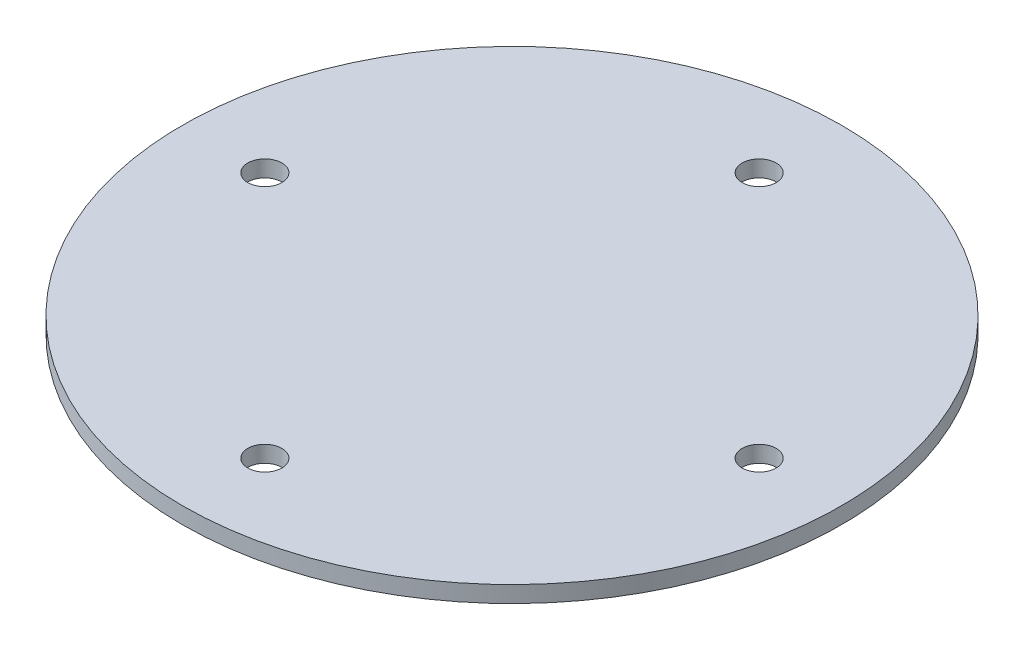
ISO-10303-21;
HEADER;
FILE_DESCRIPTION(('STEP AP214'),'2;1');
FILE_NAME('part.step','',(''),(''),'','','');
FILE_SCHEMA(('AUTOMOTIVE_DESIGN { 1 0 10303 214 1 1 1 1 }'));
ENDSEC;
DATA;
#1=APPLICATION_CONTEXT('core data for automotive mechanical design processes');
#2=APPLICATION_PROTOCOL_DEFINITION('international standard','automotive_design',2000,#1);
#3=PRODUCT_CONTEXT('',#1,'mechanical');
#4=PRODUCT('Part','Part','',(#3));
#5=PRODUCT_RELATED_PRODUCT_CATEGORY('part','',(#4));
#6=PRODUCT_DEFINITION_FORMATION('','',#4);
#7=PRODUCT_DEFINITION_CONTEXT('part definition',#1,'design');
#8=PRODUCT_DEFINITION('design','',#6,#7);
#9=PRODUCT_DEFINITION_SHAPE('','',#8);
#10=(LENGTH_UNIT() NAMED_UNIT(*) SI_UNIT(.MILLI.,.METRE.));
#11=(NAMED_UNIT(*) PLANE_ANGLE_UNIT() SI_UNIT($,.RADIAN.));
#12=(NAMED_UNIT(*) SI_UNIT($,.STERADIAN.) SOLID_ANGLE_UNIT());
#13=UNCERTAINTY_MEASURE_WITH_UNIT(LENGTH_MEASURE(1.E-05),#10,'distance_accuracy_value','');
#14=(GEOMETRIC_REPRESENTATION_CONTEXT(3) GLOBAL_UNCERTAINTY_ASSIGNED_CONTEXT((#13)) GLOBAL_UNIT_ASSIGNED_CONTEXT((#10,
#11,#12)) REPRESENTATION_CONTEXT('',''));
#15=CARTESIAN_POINT('',(0.,0.,0.));
#16=DIRECTION('',(0.,0.,1.));
#17=DIRECTION('',(1.,0.,0.));
#18=AXIS2_PLACEMENT_3D('',#15,#16,#17);
#19=CARTESIAN_POINT('',(0.,3.,0.));
#20=DIRECTION('',(0.,1.,0.));
#21=DIRECTION('',(0.,0.,1.));
#22=AXIS2_PLACEMENT_3D('',#19,#20,#21);
#23=PLANE('',#22);
#24=CARTESIAN_POINT('',(45.,3.,3.14233320495882E-13));
#25=DIRECTION('',(0.,1.,0.));
#26=DIRECTION('',(0.,0.,1.));
#27=AXIS2_PLACEMENT_3D('',#24,#25,#26);
#28=CIRCLE('',#27,3.1);
#29=CARTESIAN_POINT('',(45.,3.,3.10000000000031));
#30=VERTEX_POINT('',#29);
#31=EDGE_CURVE('E56',#30,#30,#28,.T.);
#32=ORIENTED_EDGE('',*,*,#31,.F.);
#33=EDGE_LOOP('',(#32));
#34=FACE_BOUND('',#33,.T.);
#35=CARTESIAN_POINT('',(-45.,3.,0.));
#36=DIRECTION('',(0.,1.,0.));
#37=DIRECTION('',(0.,0.,1.));
#38=AXIS2_PLACEMENT_3D('',#35,#36,#37);
#39=CIRCLE('',#38,3.1);
#40=CARTESIAN_POINT('',(-45.,3.,3.1));
#41=VERTEX_POINT('',#40);
#42=EDGE_CURVE('E48',#41,#41,#39,.T.);
#43=ORIENTED_EDGE('',*,*,#42,.F.);
#44=EDGE_LOOP('',(#43));
#45=FACE_BOUND('',#44,.T.);
#46=CARTESIAN_POINT('',(0.,3.,0.));
#47=DIRECTION('',(0.,1.,0.));
#48=DIRECTION('',(0.,0.,1.));
#49=AXIS2_PLACEMENT_3D('',#46,#47,#48);
#50=CIRCLE('',#49,60.);
#51=CARTESIAN_POINT('',(0.,3.,60.));
#52=VERTEX_POINT('',#51);
#53=EDGE_CURVE('E10',#52,#52,#50,.T.);
#54=ORIENTED_EDGE('',*,*,#53,.T.);
#55=EDGE_LOOP('',(#54));
#56=FACE_BOUND('',#55,.T.);
#57=CARTESIAN_POINT('',(1.57116660247941E-13,3.,-45.));
#58=DIRECTION('',(0.,1.,0.));
#59=DIRECTION('',(0.,0.,1.));
#60=AXIS2_PLACEMENT_3D('',#57,#58,#59);
#61=CIRCLE('',#60,3.09999999999999);
#62=CARTESIAN_POINT('',(1.57116660247941E-13,3.,-41.9));
#63=VERTEX_POINT('',#62);
#64=EDGE_CURVE('E52',#63,#63,#61,.T.);
#65=ORIENTED_EDGE('',*,*,#64,.F.);
#66=EDGE_LOOP('',(#65));
#67=FACE_BOUND('',#66,.T.);
#68=CARTESIAN_POINT('',(-4.71349980743823E-13,3.,45.));
#69=DIRECTION('',(0.,1.,0.));
#70=DIRECTION('',(0.,0.,1.));
#71=AXIS2_PLACEMENT_3D('',#68,#69,#70);
#72=CIRCLE('',#71,3.09999999999999);
#73=CARTESIAN_POINT('',(-4.71349980743823E-13,3.,48.1));
#74=VERTEX_POINT('',#73);
#75=EDGE_CURVE('E65',#74,#74,#72,.T.);
#76=ORIENTED_EDGE('',*,*,#75,.F.);
#77=EDGE_LOOP('',(#76));
#78=FACE_BOUND('',#77,.T.);
#79=ADVANCED_FACE('F40',(#34,#45,#56,#67,#78),#23,.T.);
#80=CARTESIAN_POINT('',(0.,0.,0.));
#81=DIRECTION('',(0.,1.,0.));
#82=DIRECTION('',(0.,0.,1.));
#83=AXIS2_PLACEMENT_3D('',#80,#81,#82);
#84=PLANE('',#83);
#85=CARTESIAN_POINT('',(0.,0.,0.));
#86=DIRECTION('',(0.,1.,0.));
#87=DIRECTION('',(0.,0.,1.));
#88=AXIS2_PLACEMENT_3D('',#85,#86,#87);
#89=CIRCLE('',#88,60.);
#90=CARTESIAN_POINT('',(0.,0.,60.));
#91=VERTEX_POINT('',#90);
#92=EDGE_CURVE('E41',#91,#91,#89,.T.);
#93=ORIENTED_EDGE('',*,*,#92,.F.);
#94=EDGE_LOOP('',(#93));
#95=FACE_BOUND('',#94,.T.);
#96=CARTESIAN_POINT('',(-45.,0.,0.));
#97=DIRECTION('',(0.,1.,0.));
#98=DIRECTION('',(0.,0.,1.));
#99=AXIS2_PLACEMENT_3D('',#96,#97,#98);
#100=CIRCLE('',#99,3.1);
#101=CARTESIAN_POINT('',(-45.,0.,3.1));
#102=VERTEX_POINT('',#101);
#103=EDGE_CURVE('E49',#102,#102,#100,.T.);
#104=ORIENTED_EDGE('',*,*,#103,.T.);
#105=EDGE_LOOP('',(#104));
#106=FACE_BOUND('',#105,.T.);
#107=CARTESIAN_POINT('',(1.57116660247941E-13,0.,-45.));
#108=DIRECTION('',(0.,1.,0.));
#109=DIRECTION('',(0.,0.,1.));
#110=AXIS2_PLACEMENT_3D('',#107,#108,#109);
#111=CIRCLE('',#110,3.09999999999999);
#112=CARTESIAN_POINT('',(1.57116660247941E-13,0.,-41.9));
#113=VERTEX_POINT('',#112);
#114=EDGE_CURVE('E57',#113,#113,#111,.T.);
#115=ORIENTED_EDGE('',*,*,#114,.T.);
#116=EDGE_LOOP('',(#115));
#117=FACE_BOUND('',#116,.T.);
#118=CARTESIAN_POINT('',(45.,0.,3.14233320495882E-13));
#119=DIRECTION('',(0.,1.,0.));
#120=DIRECTION('',(0.,0.,1.));
#121=AXIS2_PLACEMENT_3D('',#118,#119,#120);
#122=CIRCLE('',#121,3.1);
#123=CARTESIAN_POINT('',(45.,0.,3.10000000000031));
#124=VERTEX_POINT('',#123);
#125=EDGE_CURVE('E62',#124,#124,#122,.T.);
#126=ORIENTED_EDGE('',*,*,#125,.T.);
#127=EDGE_LOOP('',(#126));
#128=FACE_BOUND('',#127,.T.);
#129=CARTESIAN_POINT('',(-4.71349980743823E-13,0.,45.));
#130=DIRECTION('',(0.,1.,0.));
#131=DIRECTION('',(0.,0.,1.));
#132=AXIS2_PLACEMENT_3D('',#129,#130,#131);
#133=CIRCLE('',#132,3.09999999999999);
#134=CARTESIAN_POINT('',(-4.71349980743823E-13,0.,48.1));
#135=VERTEX_POINT('',#134);
#136=EDGE_CURVE('E66',#135,#135,#133,.T.);
#137=ORIENTED_EDGE('',*,*,#136,.T.);
#138=EDGE_LOOP('',(#137));
#139=FACE_BOUND('',#138,.T.);
#140=ADVANCED_FACE('F76',(#95,#106,#117,#128,#139),#84,.F.);
#141=CARTESIAN_POINT('',(0.,3.,0.));
#142=DIRECTION('',(0.,-1.,0.));
#143=DIRECTION('',(0.,0.,-1.));
#144=AXIS2_PLACEMENT_3D('',#141,#142,#143);
#145=CYLINDRICAL_SURFACE('',#144,60.);
#146=ORIENTED_EDGE('',*,*,#53,.F.);
#147=EDGE_LOOP('',(#146));
#148=FACE_BOUND('',#147,.T.);
#149=ORIENTED_EDGE('',*,*,#92,.T.);
#150=EDGE_LOOP('',(#149));
#151=FACE_BOUND('',#150,.T.);
#152=ADVANCED_FACE('F39',(#148,#151),#145,.T.);
#153=CARTESIAN_POINT('',(-45.,3.,0.));
#154=DIRECTION('',(0.,-1.,0.));
#155=DIRECTION('',(0.,0.,-1.));
#156=AXIS2_PLACEMENT_3D('',#153,#154,#155);
#157=CYLINDRICAL_SURFACE('',#156,3.1);
#158=ORIENTED_EDGE('',*,*,#42,.T.);
#159=EDGE_LOOP('',(#158));
#160=FACE_BOUND('',#159,.T.);
#161=ORIENTED_EDGE('',*,*,#103,.F.);
#162=EDGE_LOOP('',(#161));
#163=FACE_BOUND('',#162,.T.);
#164=ADVANCED_FACE('F88',(#160,#163),#157,.F.);
#165=CARTESIAN_POINT('',(1.57116660247941E-13,3.,-45.));
#166=DIRECTION('',(0.,-1.,0.));
#167=DIRECTION('',(0.,0.,-1.));
#168=AXIS2_PLACEMENT_3D('',#165,#166,#167);
#169=CYLINDRICAL_SURFACE('',#168,3.09999999999999);
#170=ORIENTED_EDGE('',*,*,#64,.T.);
#171=EDGE_LOOP('',(#170));
#172=FACE_BOUND('',#171,.T.);
#173=ORIENTED_EDGE('',*,*,#114,.F.);
#174=EDGE_LOOP('',(#173));
#175=FACE_BOUND('',#174,.T.);
#176=ADVANCED_FACE('F91',(#172,#175),#169,.F.);
#177=CARTESIAN_POINT('',(45.,3.,3.14233320495882E-13));
#178=DIRECTION('',(0.,-1.,0.));
#179=DIRECTION('',(0.,0.,-1.));
#180=AXIS2_PLACEMENT_3D('',#177,#178,#179);
#181=CYLINDRICAL_SURFACE('',#180,3.1);
#182=ORIENTED_EDGE('',*,*,#31,.T.);
#183=EDGE_LOOP('',(#182));
#184=FACE_BOUND('',#183,.T.);
#185=ORIENTED_EDGE('',*,*,#125,.F.);
#186=EDGE_LOOP('',(#185));
#187=FACE_BOUND('',#186,.T.);
#188=ADVANCED_FACE('F94',(#184,#187),#181,.F.);
#189=CARTESIAN_POINT('',(-4.71349980743823E-13,3.,45.));
#190=DIRECTION('',(0.,-1.,0.));
#191=DIRECTION('',(0.,0.,-1.));
#192=AXIS2_PLACEMENT_3D('',#189,#190,#191);
#193=CYLINDRICAL_SURFACE('',#192,3.09999999999999);
#194=ORIENTED_EDGE('',*,*,#75,.T.);
#195=EDGE_LOOP('',(#194));
#196=FACE_BOUND('',#195,.T.);
#197=ORIENTED_EDGE('',*,*,#136,.F.);
#198=EDGE_LOOP('',(#197));
#199=FACE_BOUND('',#198,.T.);
#200=ADVANCED_FACE('F73',(#196,#199),#193,.F.);
#201=CLOSED_SHELL('',(#79,#140,#152,#164,#176,#188,#200));
#202=MANIFOLD_SOLID_BREP('B2',#201);
#203=ADVANCED_BREP_SHAPE_REPRESENTATION('',(#18,#202),#14);
#204=SHAPE_DEFINITION_REPRESENTATION(#9,#203);
ENDSEC;
END-ISO-10303-21;
